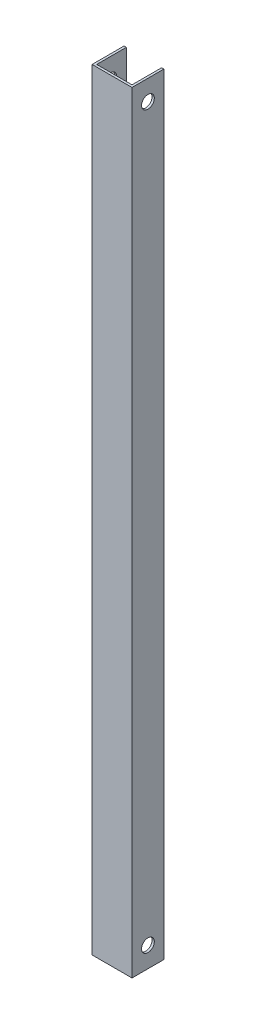
ISO-10303-21;
HEADER;
FILE_DESCRIPTION(('STEP AP214'),'2;1');
FILE_NAME('part.step','',(''),(''),'','','');
FILE_SCHEMA(('AUTOMOTIVE_DESIGN { 1 0 10303 214 1 1 1 1 }'));
ENDSEC;
DATA;
#1=APPLICATION_CONTEXT('core data for automotive mechanical design processes');
#2=APPLICATION_PROTOCOL_DEFINITION('international standard','automotive_design',2000,#1);
#3=PRODUCT_CONTEXT('',#1,'mechanical');
#4=PRODUCT('Part','Part','',(#3));
#5=PRODUCT_RELATED_PRODUCT_CATEGORY('part','',(#4));
#6=PRODUCT_DEFINITION_FORMATION('','',#4);
#7=PRODUCT_DEFINITION_CONTEXT('part definition',#1,'design');
#8=PRODUCT_DEFINITION('design','',#6,#7);
#9=PRODUCT_DEFINITION_SHAPE('','',#8);
#10=(LENGTH_UNIT() NAMED_UNIT(*) SI_UNIT(.MILLI.,.METRE.));
#11=(NAMED_UNIT(*) PLANE_ANGLE_UNIT() SI_UNIT($,.RADIAN.));
#12=(NAMED_UNIT(*) SI_UNIT($,.STERADIAN.) SOLID_ANGLE_UNIT());
#13=UNCERTAINTY_MEASURE_WITH_UNIT(LENGTH_MEASURE(1.E-05),#10,'distance_accuracy_value','');
#14=(GEOMETRIC_REPRESENTATION_CONTEXT(3) GLOBAL_UNCERTAINTY_ASSIGNED_CONTEXT((#13)) GLOBAL_UNIT_ASSIGNED_CONTEXT((#10,
#11,#12)) REPRESENTATION_CONTEXT('',''));
#15=CARTESIAN_POINT('',(0.,0.,0.));
#16=DIRECTION('',(0.,0.,1.));
#17=DIRECTION('',(1.,0.,0.));
#18=AXIS2_PLACEMENT_3D('',#15,#16,#17);
#19=CARTESIAN_POINT('',(-7.5,-145.,-6.));
#20=DIRECTION('',(0.,0.,-1.));
#21=DIRECTION('',(-1.,0.,0.));
#22=AXIS2_PLACEMENT_3D('',#19,#20,#21);
#23=PLANE('',#22);
#24=DIRECTION('',(-1.,0.,0.));
#25=VECTOR('',#24,1.);
#26=CARTESIAN_POINT('',(-7.5,145.,-6.));
#27=LINE('',#26,#25);
#28=CARTESIAN_POINT('',(-6.64,145.,-6.));
#29=VERTEX_POINT('',#28);
#30=CARTESIAN_POINT('',(-7.5,145.,-6.));
#31=VERTEX_POINT('',#30);
#32=EDGE_CURVE('E132',#29,#31,#27,.T.);
#33=ORIENTED_EDGE('',*,*,#32,.F.);
#34=DIRECTION('',(0.,-1.,0.));
#35=VECTOR('',#34,1.);
#36=CARTESIAN_POINT('',(-6.64,-145.,-6.));
#37=LINE('',#36,#35);
#38=CARTESIAN_POINT('',(-6.64,-145.,-6.));
#39=VERTEX_POINT('',#38);
#40=EDGE_CURVE('E122',#29,#39,#37,.T.);
#41=ORIENTED_EDGE('',*,*,#40,.T.);
#42=DIRECTION('',(-1.,0.,0.));
#43=VECTOR('',#42,1.);
#44=CARTESIAN_POINT('',(-7.5,-145.,-6.));
#45=LINE('',#44,#43);
#46=CARTESIAN_POINT('',(-7.5,-145.,-6.));
#47=VERTEX_POINT('',#46);
#48=EDGE_CURVE('E144',#39,#47,#45,.T.);
#49=ORIENTED_EDGE('',*,*,#48,.T.);
#50=DIRECTION('',(0.,1.,0.));
#51=VECTOR('',#50,1.);
#52=CARTESIAN_POINT('',(-7.5,-145.,-6.));
#53=LINE('',#52,#51);
#54=EDGE_CURVE('E158',#47,#31,#53,.T.);
#55=ORIENTED_EDGE('',*,*,#54,.T.);
#56=EDGE_LOOP('',(#33,#41,#49,#55));
#57=FACE_BOUND('',#56,.T.);
#58=ADVANCED_FACE('F33',(#57),#23,.T.);
#59=CARTESIAN_POINT('',(7.5,-145.,-6.));
#60=VERTEX_POINT('',#59);
#61=CARTESIAN_POINT('',(6.64,-145.,-6.));
#62=VERTEX_POINT('',#61);
#63=EDGE_CURVE('E145',#60,#62,#45,.T.);
#64=ORIENTED_EDGE('',*,*,#63,.T.);
#65=DIRECTION('',(0.,1.,0.));
#66=VECTOR('',#65,1.);
#67=CARTESIAN_POINT('',(6.64,-145.,-6.));
#68=LINE('',#67,#66);
#69=CARTESIAN_POINT('',(6.64,145.,-6.));
#70=VERTEX_POINT('',#69);
#71=EDGE_CURVE('E102',#62,#70,#68,.T.);
#72=ORIENTED_EDGE('',*,*,#71,.T.);
#73=CARTESIAN_POINT('',(7.5,145.,-6.));
#74=VERTEX_POINT('',#73);
#75=EDGE_CURVE('E133',#74,#70,#27,.T.);
#76=ORIENTED_EDGE('',*,*,#75,.F.);
#77=DIRECTION('',(0.,1.,0.));
#78=VECTOR('',#77,1.);
#79=CARTESIAN_POINT('',(7.5,-145.,-6.));
#80=LINE('',#79,#78);
#81=EDGE_CURVE('E153',#60,#74,#80,.T.);
#82=ORIENTED_EDGE('',*,*,#81,.F.);
#83=EDGE_LOOP('',(#64,#72,#76,#82));
#84=FACE_BOUND('',#83,.T.);
#85=ADVANCED_FACE('F189',(#84),#23,.T.);
#86=CARTESIAN_POINT('',(0.,-145.,0.));
#87=DIRECTION('',(0.,1.,0.));
#88=DIRECTION('',(0.,0.,1.));
#89=AXIS2_PLACEMENT_3D('',#86,#87,#88);
#90=PLANE('',#89);
#91=DIRECTION('',(0.,0.,-1.));
#92=VECTOR('',#91,1.);
#93=CARTESIAN_POINT('',(-6.64,-145.,0.));
#94=LINE('',#93,#92);
#95=CARTESIAN_POINT('',(-6.64,-145.,5.14));
#96=VERTEX_POINT('',#95);
#97=EDGE_CURVE('E121',#96,#39,#94,.T.);
#98=ORIENTED_EDGE('',*,*,#97,.F.);
#99=DIRECTION('',(-1.,0.,0.));
#100=VECTOR('',#99,1.);
#101=CARTESIAN_POINT('',(0.,-145.,5.14));
#102=LINE('',#101,#100);
#103=CARTESIAN_POINT('',(6.64,-145.,5.14));
#104=VERTEX_POINT('',#103);
#105=EDGE_CURVE('E107',#104,#96,#102,.T.);
#106=ORIENTED_EDGE('',*,*,#105,.F.);
#107=DIRECTION('',(0.,0.,1.));
#108=VECTOR('',#107,1.);
#109=CARTESIAN_POINT('',(6.64,-145.,0.));
#110=LINE('',#109,#108);
#111=EDGE_CURVE('E99',#62,#104,#110,.T.);
#112=ORIENTED_EDGE('',*,*,#111,.F.);
#113=ORIENTED_EDGE('',*,*,#63,.F.);
#114=DIRECTION('',(0.,0.,-1.));
#115=VECTOR('',#114,1.);
#116=CARTESIAN_POINT('',(7.5,-145.,-6.));
#117=LINE('',#116,#115);
#118=CARTESIAN_POINT('',(7.5,-145.,6.));
#119=VERTEX_POINT('',#118);
#120=EDGE_CURVE('E142',#119,#60,#117,.T.);
#121=ORIENTED_EDGE('',*,*,#120,.F.);
#122=DIRECTION('',(1.,0.,0.));
#123=VECTOR('',#122,1.);
#124=CARTESIAN_POINT('',(-7.5,-145.,6.));
#125=LINE('',#124,#123);
#126=CARTESIAN_POINT('',(-7.5,-145.,6.));
#127=VERTEX_POINT('',#126);
#128=EDGE_CURVE('E150',#127,#119,#125,.T.);
#129=ORIENTED_EDGE('',*,*,#128,.F.);
#130=DIRECTION('',(0.,0.,1.));
#131=VECTOR('',#130,1.);
#132=CARTESIAN_POINT('',(-7.5,-145.,-6.));
#133=LINE('',#132,#131);
#134=EDGE_CURVE('E147',#47,#127,#133,.T.);
#135=ORIENTED_EDGE('',*,*,#134,.F.);
#136=ORIENTED_EDGE('',*,*,#48,.F.);
#137=EDGE_LOOP('',(#98,#106,#112,#113,#121,#129,#135,#136));
#138=FACE_BOUND('',#137,.T.);
#139=ADVANCED_FACE('F119',(#138),#90,.F.);
#140=CARTESIAN_POINT('',(0.,145.,0.));
#141=DIRECTION('',(0.,1.,0.));
#142=DIRECTION('',(0.,0.,1.));
#143=AXIS2_PLACEMENT_3D('',#140,#141,#142);
#144=PLANE('',#143);
#145=DIRECTION('',(-1.,0.,0.));
#146=VECTOR('',#145,1.);
#147=CARTESIAN_POINT('',(0.,145.,5.14));
#148=LINE('',#147,#146);
#149=CARTESIAN_POINT('',(6.64,145.,5.14));
#150=VERTEX_POINT('',#149);
#151=CARTESIAN_POINT('',(-6.64,145.,5.14));
#152=VERTEX_POINT('',#151);
#153=EDGE_CURVE('E42',#150,#152,#148,.T.);
#154=ORIENTED_EDGE('',*,*,#153,.T.);
#155=DIRECTION('',(0.,0.,-1.));
#156=VECTOR('',#155,1.);
#157=CARTESIAN_POINT('',(-6.64,145.,0.));
#158=LINE('',#157,#156);
#159=EDGE_CURVE('E11',#152,#29,#158,.T.);
#160=ORIENTED_EDGE('',*,*,#159,.T.);
#161=ORIENTED_EDGE('',*,*,#32,.T.);
#162=DIRECTION('',(0.,0.,1.));
#163=VECTOR('',#162,1.);
#164=CARTESIAN_POINT('',(-7.5,145.,-6.));
#165=LINE('',#164,#163);
#166=CARTESIAN_POINT('',(-7.5,145.,6.));
#167=VERTEX_POINT('',#166);
#168=EDGE_CURVE('E136',#31,#167,#165,.T.);
#169=ORIENTED_EDGE('',*,*,#168,.T.);
#170=DIRECTION('',(1.,0.,0.));
#171=VECTOR('',#170,1.);
#172=CARTESIAN_POINT('',(-7.5,145.,6.));
#173=LINE('',#172,#171);
#174=CARTESIAN_POINT('',(7.5,145.,6.));
#175=VERTEX_POINT('',#174);
#176=EDGE_CURVE('E139',#167,#175,#173,.T.);
#177=ORIENTED_EDGE('',*,*,#176,.T.);
#178=DIRECTION('',(0.,0.,-1.));
#179=VECTOR('',#178,1.);
#180=CARTESIAN_POINT('',(7.5,145.,-6.));
#181=LINE('',#180,#179);
#182=EDGE_CURVE('E129',#175,#74,#181,.T.);
#183=ORIENTED_EDGE('',*,*,#182,.T.);
#184=ORIENTED_EDGE('',*,*,#75,.T.);
#185=DIRECTION('',(0.,0.,1.));
#186=VECTOR('',#185,1.);
#187=CARTESIAN_POINT('',(6.64,145.,0.));
#188=LINE('',#187,#186);
#189=EDGE_CURVE('E155',#70,#150,#188,.T.);
#190=ORIENTED_EDGE('',*,*,#189,.T.);
#191=EDGE_LOOP('',(#154,#160,#161,#169,#177,#183,#184,#190));
#192=FACE_BOUND('',#191,.T.);
#193=ADVANCED_FACE('F191',(#192),#144,.T.);
#194=CARTESIAN_POINT('',(7.5,-145.,-6.));
#195=DIRECTION('',(1.,0.,0.));
#196=DIRECTION('',(0.,0.,-1.));
#197=AXIS2_PLACEMENT_3D('',#194,#195,#196);
#198=PLANE('',#197);
#199=CARTESIAN_POINT('',(7.50000000000001,137.33,0.));
#200=DIRECTION('',(1.,0.,0.));
#201=DIRECTION('',(0.,0.,-1.));
#202=AXIS2_PLACEMENT_3D('',#199,#200,#201);
#203=CIRCLE('',#202,2.40000000000001);
#204=CARTESIAN_POINT('',(7.50000000000001,137.33,-2.40000000000003));
#205=VERTEX_POINT('',#204);
#206=EDGE_CURVE('E116',#205,#205,#203,.F.);
#207=ORIENTED_EDGE('',*,*,#206,.T.);
#208=EDGE_LOOP('',(#207));
#209=FACE_BOUND('',#208,.T.);
#210=CARTESIAN_POINT('',(7.50000000000001,-137.33,0.));
#211=DIRECTION('',(1.,0.,0.));
#212=DIRECTION('',(0.,0.,-1.));
#213=AXIS2_PLACEMENT_3D('',#210,#211,#212);
#214=CIRCLE('',#213,2.40000000000001);
#215=CARTESIAN_POINT('',(7.50000000000001,-137.33,-2.40000000000003));
#216=VERTEX_POINT('',#215);
#217=EDGE_CURVE('E174',#216,#216,#214,.F.);
#218=ORIENTED_EDGE('',*,*,#217,.T.);
#219=EDGE_LOOP('',(#218));
#220=FACE_BOUND('',#219,.T.);
#221=ORIENTED_EDGE('',*,*,#81,.T.);
#222=ORIENTED_EDGE('',*,*,#182,.F.);
#223=DIRECTION('',(0.,1.,0.));
#224=VECTOR('',#223,1.);
#225=CARTESIAN_POINT('',(7.5,-145.,6.));
#226=LINE('',#225,#224);
#227=EDGE_CURVE('E58',#119,#175,#226,.T.);
#228=ORIENTED_EDGE('',*,*,#227,.F.);
#229=ORIENTED_EDGE('',*,*,#120,.T.);
#230=EDGE_LOOP('',(#221,#222,#228,#229));
#231=FACE_BOUND('',#230,.T.);
#232=ADVANCED_FACE('F35',(#209,#220,#231),#198,.T.);
#233=CARTESIAN_POINT('',(-7.5,-145.,6.));
#234=DIRECTION('',(0.,0.,1.));
#235=DIRECTION('',(1.,0.,0.));
#236=AXIS2_PLACEMENT_3D('',#233,#234,#235);
#237=PLANE('',#236);
#238=ORIENTED_EDGE('',*,*,#227,.T.);
#239=ORIENTED_EDGE('',*,*,#176,.F.);
#240=DIRECTION('',(0.,1.,0.));
#241=VECTOR('',#240,1.);
#242=CARTESIAN_POINT('',(-7.5,-145.,6.));
#243=LINE('',#242,#241);
#244=EDGE_CURVE('E156',#127,#167,#243,.T.);
#245=ORIENTED_EDGE('',*,*,#244,.F.);
#246=ORIENTED_EDGE('',*,*,#128,.T.);
#247=EDGE_LOOP('',(#238,#239,#245,#246));
#248=FACE_BOUND('',#247,.T.);
#249=ADVANCED_FACE('F196',(#248),#237,.T.);
#250=CARTESIAN_POINT('',(-7.5,-145.,-6.));
#251=DIRECTION('',(-1.,0.,0.));
#252=DIRECTION('',(0.,0.,1.));
#253=AXIS2_PLACEMENT_3D('',#250,#251,#252);
#254=PLANE('',#253);
#255=CARTESIAN_POINT('',(-7.50000000000001,137.33,0.));
#256=DIRECTION('',(-1.,0.,0.));
#257=DIRECTION('',(0.,0.,1.));
#258=AXIS2_PLACEMENT_3D('',#255,#256,#257);
#259=CIRCLE('',#258,2.40000000000001);
#260=CARTESIAN_POINT('',(-7.50000000000001,137.33,2.39999999999998));
#261=VERTEX_POINT('',#260);
#262=EDGE_CURVE('E182',#261,#261,#259,.F.);
#263=ORIENTED_EDGE('',*,*,#262,.T.);
#264=EDGE_LOOP('',(#263));
#265=FACE_BOUND('',#264,.T.);
#266=CARTESIAN_POINT('',(-7.50000000000001,-137.33,0.));
#267=DIRECTION('',(-1.,0.,0.));
#268=DIRECTION('',(0.,0.,1.));
#269=AXIS2_PLACEMENT_3D('',#266,#267,#268);
#270=CIRCLE('',#269,2.40000000000001);
#271=CARTESIAN_POINT('',(-7.50000000000001,-137.33,2.39999999999998));
#272=VERTEX_POINT('',#271);
#273=EDGE_CURVE('E169',#272,#272,#270,.F.);
#274=ORIENTED_EDGE('',*,*,#273,.T.);
#275=EDGE_LOOP('',(#274));
#276=FACE_BOUND('',#275,.T.);
#277=ORIENTED_EDGE('',*,*,#244,.T.);
#278=ORIENTED_EDGE('',*,*,#168,.F.);
#279=ORIENTED_EDGE('',*,*,#54,.F.);
#280=ORIENTED_EDGE('',*,*,#134,.T.);
#281=EDGE_LOOP('',(#277,#278,#279,#280));
#282=FACE_BOUND('',#281,.T.);
#283=ADVANCED_FACE('F200',(#265,#276,#282),#254,.T.);
#284=CARTESIAN_POINT('',(-6.64,200.,-8.86));
#285=DIRECTION('',(1.,0.,0.));
#286=DIRECTION('',(0.,0.,-1.));
#287=AXIS2_PLACEMENT_3D('',#284,#285,#286);
#288=PLANE('',#287);
#289=CARTESIAN_POINT('',(-6.64000000000001,137.33,0.));
#290=DIRECTION('',(1.,0.,0.));
#291=DIRECTION('',(0.,0.,-1.));
#292=AXIS2_PLACEMENT_3D('',#289,#290,#291);
#293=CIRCLE('',#292,2.40000000000001);
#294=CARTESIAN_POINT('',(-6.64000000000001,137.33,-2.40000000000003));
#295=VERTEX_POINT('',#294);
#296=EDGE_CURVE('E179',#295,#295,#293,.F.);
#297=ORIENTED_EDGE('',*,*,#296,.T.);
#298=EDGE_LOOP('',(#297));
#299=FACE_BOUND('',#298,.T.);
#300=CARTESIAN_POINT('',(-6.64000000000001,-137.33,0.));
#301=DIRECTION('',(1.,0.,0.));
#302=DIRECTION('',(0.,0.,-1.));
#303=AXIS2_PLACEMENT_3D('',#300,#301,#302);
#304=CIRCLE('',#303,2.40000000000001);
#305=CARTESIAN_POINT('',(-6.64000000000001,-137.33,-2.40000000000003));
#306=VERTEX_POINT('',#305);
#307=EDGE_CURVE('E165',#306,#306,#304,.F.);
#308=ORIENTED_EDGE('',*,*,#307,.T.);
#309=EDGE_LOOP('',(#308));
#310=FACE_BOUND('',#309,.T.);
#311=ORIENTED_EDGE('',*,*,#97,.T.);
#312=ORIENTED_EDGE('',*,*,#40,.F.);
#313=ORIENTED_EDGE('',*,*,#159,.F.);
#314=DIRECTION('',(0.,-1.,0.));
#315=VECTOR('',#314,1.);
#316=CARTESIAN_POINT('',(-6.64,200.,5.14));
#317=LINE('',#316,#315);
#318=EDGE_CURVE('E115',#152,#96,#317,.T.);
#319=ORIENTED_EDGE('',*,*,#318,.T.);
#320=EDGE_LOOP('',(#311,#312,#313,#319));
#321=FACE_BOUND('',#320,.T.);
#322=ADVANCED_FACE('F204',(#299,#310,#321),#288,.T.);
#323=CARTESIAN_POINT('',(-6.64,200.,5.14));
#324=DIRECTION('',(0.,0.,-1.));
#325=DIRECTION('',(-1.,0.,0.));
#326=AXIS2_PLACEMENT_3D('',#323,#324,#325);
#327=PLANE('',#326);
#328=ORIENTED_EDGE('',*,*,#105,.T.);
#329=ORIENTED_EDGE('',*,*,#318,.F.);
#330=ORIENTED_EDGE('',*,*,#153,.F.);
#331=DIRECTION('',(0.,-1.,0.));
#332=VECTOR('',#331,1.);
#333=CARTESIAN_POINT('',(6.64,200.,5.14));
#334=LINE('',#333,#332);
#335=EDGE_CURVE('E50',#150,#104,#334,.T.);
#336=ORIENTED_EDGE('',*,*,#335,.T.);
#337=EDGE_LOOP('',(#328,#329,#330,#336));
#338=FACE_BOUND('',#337,.T.);
#339=ADVANCED_FACE('F110',(#338),#327,.T.);
#340=CARTESIAN_POINT('',(6.64,200.,5.14));
#341=DIRECTION('',(-1.,0.,0.));
#342=DIRECTION('',(0.,0.,1.));
#343=AXIS2_PLACEMENT_3D('',#340,#341,#342);
#344=PLANE('',#343);
#345=CARTESIAN_POINT('',(6.64000000000001,137.33,0.));
#346=DIRECTION('',(-1.,0.,0.));
#347=DIRECTION('',(0.,0.,1.));
#348=AXIS2_PLACEMENT_3D('',#345,#346,#347);
#349=CIRCLE('',#348,2.40000000000001);
#350=CARTESIAN_POINT('',(6.64000000000001,137.33,2.39999999999998));
#351=VERTEX_POINT('',#350);
#352=EDGE_CURVE('E37',#351,#351,#349,.F.);
#353=ORIENTED_EDGE('',*,*,#352,.T.);
#354=EDGE_LOOP('',(#353));
#355=FACE_BOUND('',#354,.T.);
#356=CARTESIAN_POINT('',(6.64000000000001,-137.33,0.));
#357=DIRECTION('',(-1.,0.,0.));
#358=DIRECTION('',(0.,0.,1.));
#359=AXIS2_PLACEMENT_3D('',#356,#357,#358);
#360=CIRCLE('',#359,2.40000000000001);
#361=CARTESIAN_POINT('',(6.64000000000001,-137.33,2.39999999999998));
#362=VERTEX_POINT('',#361);
#363=EDGE_CURVE('E163',#362,#362,#360,.F.);
#364=ORIENTED_EDGE('',*,*,#363,.T.);
#365=EDGE_LOOP('',(#364));
#366=FACE_BOUND('',#365,.T.);
#367=ORIENTED_EDGE('',*,*,#111,.T.);
#368=ORIENTED_EDGE('',*,*,#335,.F.);
#369=ORIENTED_EDGE('',*,*,#189,.F.);
#370=ORIENTED_EDGE('',*,*,#71,.F.);
#371=EDGE_LOOP('',(#367,#368,#369,#370));
#372=FACE_BOUND('',#371,.T.);
#373=ADVANCED_FACE('F100',(#355,#366,#372),#344,.T.);
#374=CARTESIAN_POINT('',(200.,-137.33,0.));
#375=DIRECTION('',(-1.,0.,0.));
#376=DIRECTION('',(0.,0.,1.));
#377=AXIS2_PLACEMENT_3D('',#374,#375,#376);
#378=CYLINDRICAL_SURFACE('',#377,2.40000000000001);
#379=ORIENTED_EDGE('',*,*,#217,.F.);
#380=EDGE_LOOP('',(#379));
#381=FACE_BOUND('',#380,.T.);
#382=ORIENTED_EDGE('',*,*,#363,.F.);
#383=EDGE_LOOP('',(#382));
#384=FACE_BOUND('',#383,.T.);
#385=ADVANCED_FACE('F235',(#381,#384),#378,.F.);
#386=CARTESIAN_POINT('',(200.,137.33,0.));
#387=DIRECTION('',(-1.,0.,0.));
#388=DIRECTION('',(0.,0.,1.));
#389=AXIS2_PLACEMENT_3D('',#386,#387,#388);
#390=CYLINDRICAL_SURFACE('',#389,2.40000000000001);
#391=ORIENTED_EDGE('',*,*,#206,.F.);
#392=EDGE_LOOP('',(#391));
#393=FACE_BOUND('',#392,.T.);
#394=ORIENTED_EDGE('',*,*,#352,.F.);
#395=EDGE_LOOP('',(#394));
#396=FACE_BOUND('',#395,.T.);
#397=ADVANCED_FACE('F238',(#393,#396),#390,.F.);
#398=ORIENTED_EDGE('',*,*,#273,.F.);
#399=EDGE_LOOP('',(#398));
#400=FACE_BOUND('',#399,.T.);
#401=ORIENTED_EDGE('',*,*,#307,.F.);
#402=EDGE_LOOP('',(#401));
#403=FACE_BOUND('',#402,.T.);
#404=ADVANCED_FACE('F240',(#400,#403),#378,.F.);
#405=ORIENTED_EDGE('',*,*,#262,.F.);
#406=EDGE_LOOP('',(#405));
#407=FACE_BOUND('',#406,.T.);
#408=ORIENTED_EDGE('',*,*,#296,.F.);
#409=EDGE_LOOP('',(#408));
#410=FACE_BOUND('',#409,.T.);
#411=ADVANCED_FACE('F247',(#407,#410),#390,.F.);
#412=CLOSED_SHELL('',(#58,#85,#139,#193,#232,#249,#283,#322,#339,#373,#385,#397,#404,#411));
#413=MANIFOLD_SOLID_BREP('B2',#412);
#414=ADVANCED_BREP_SHAPE_REPRESENTATION('',(#18,#413),#14);
#415=SHAPE_DEFINITION_REPRESENTATION(#9,#414);
ENDSEC;
END-ISO-10303-21;
